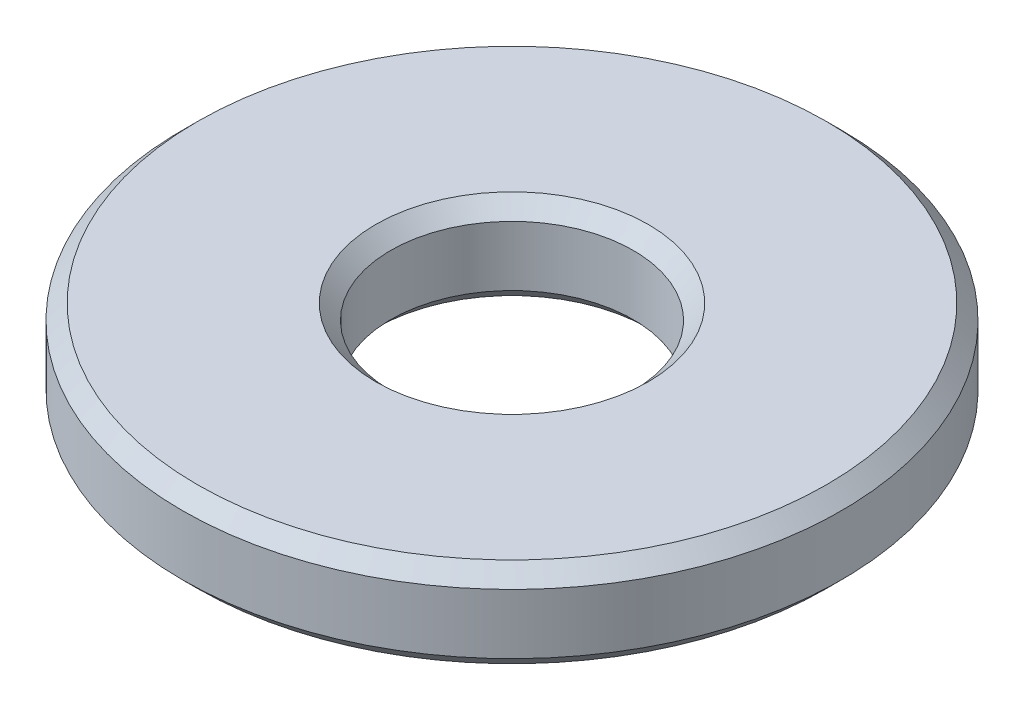
ISO-10303-21;
HEADER;
FILE_DESCRIPTION(('STEP AP214'),'2;1');
FILE_NAME('part.step','',(''),(''),'','','');
FILE_SCHEMA(('AUTOMOTIVE_DESIGN { 1 0 10303 214 1 1 1 1 }'));
ENDSEC;
DATA;
#1=APPLICATION_CONTEXT('core data for automotive mechanical design processes');
#2=APPLICATION_PROTOCOL_DEFINITION('international standard','automotive_design',2000,#1);
#3=PRODUCT_CONTEXT('',#1,'mechanical');
#4=PRODUCT('Part','Part','',(#3));
#5=PRODUCT_RELATED_PRODUCT_CATEGORY('part','',(#4));
#6=PRODUCT_DEFINITION_FORMATION('','',#4);
#7=PRODUCT_DEFINITION_CONTEXT('part definition',#1,'design');
#8=PRODUCT_DEFINITION('design','',#6,#7);
#9=PRODUCT_DEFINITION_SHAPE('','',#8);
#10=(LENGTH_UNIT() NAMED_UNIT(*) SI_UNIT(.MILLI.,.METRE.));
#11=(NAMED_UNIT(*) PLANE_ANGLE_UNIT() SI_UNIT($,.RADIAN.));
#12=(NAMED_UNIT(*) SI_UNIT($,.STERADIAN.) SOLID_ANGLE_UNIT());
#13=UNCERTAINTY_MEASURE_WITH_UNIT(LENGTH_MEASURE(1.E-05),#10,'distance_accuracy_value','');
#14=(GEOMETRIC_REPRESENTATION_CONTEXT(3) GLOBAL_UNCERTAINTY_ASSIGNED_CONTEXT((#13)) GLOBAL_UNIT_ASSIGNED_CONTEXT((#10,
#11,#12)) REPRESENTATION_CONTEXT('',''));
#15=CARTESIAN_POINT('',(0.,0.,0.));
#16=DIRECTION('',(0.,0.,1.));
#17=DIRECTION('',(1.,0.,0.));
#18=AXIS2_PLACEMENT_3D('',#15,#16,#17);
#19=CARTESIAN_POINT('',(0.,1.5,0.));
#20=DIRECTION('',(0.,1.,0.));
#21=DIRECTION('',(0.,0.,1.));
#22=AXIS2_PLACEMENT_3D('',#19,#20,#21);
#23=PLANE('',#22);
#24=CARTESIAN_POINT('',(0.,1.5,0.));
#25=DIRECTION('',(0.,1.,0.));
#26=DIRECTION('',(0.,0.,1.));
#27=AXIS2_PLACEMENT_3D('',#24,#25,#26);
#28=CIRCLE('',#27,10.5);
#29=CARTESIAN_POINT('',(0.,1.5,10.5));
#30=VERTEX_POINT('',#29);
#31=EDGE_CURVE('E53',#30,#30,#28,.T.);
#32=ORIENTED_EDGE('',*,*,#31,.T.);
#33=EDGE_LOOP('',(#32));
#34=FACE_BOUND('',#33,.T.);
#35=CARTESIAN_POINT('',(0.,1.5,0.));
#36=DIRECTION('',(0.,1.,0.));
#37=DIRECTION('',(0.,0.,1.));
#38=AXIS2_PLACEMENT_3D('',#35,#36,#37);
#39=CIRCLE('',#38,4.55000000000001);
#40=CARTESIAN_POINT('',(0.,1.5,4.55000000000001));
#41=VERTEX_POINT('',#40);
#42=EDGE_CURVE('E58',#41,#41,#39,.F.);
#43=ORIENTED_EDGE('',*,*,#42,.T.);
#44=EDGE_LOOP('',(#43));
#45=FACE_BOUND('',#44,.T.);
#46=ADVANCED_FACE('F39',(#34,#45),#23,.T.);
#47=CARTESIAN_POINT('',(0.,-1.5,0.));
#48=DIRECTION('',(0.,1.,0.));
#49=DIRECTION('',(0.,0.,1.));
#50=AXIS2_PLACEMENT_3D('',#47,#48,#49);
#51=PLANE('',#50);
#52=CARTESIAN_POINT('',(0.,-1.5,0.));
#53=DIRECTION('',(0.,1.,0.));
#54=DIRECTION('',(0.,0.,1.));
#55=AXIS2_PLACEMENT_3D('',#52,#53,#54);
#56=CIRCLE('',#55,10.5);
#57=CARTESIAN_POINT('',(0.,-1.5,10.5));
#58=VERTEX_POINT('',#57);
#59=EDGE_CURVE('E64',#58,#58,#56,.F.);
#60=ORIENTED_EDGE('',*,*,#59,.T.);
#61=EDGE_LOOP('',(#60));
#62=FACE_BOUND('',#61,.T.);
#63=CARTESIAN_POINT('',(0.,-1.5,0.));
#64=DIRECTION('',(0.,1.,0.));
#65=DIRECTION('',(0.,0.,1.));
#66=AXIS2_PLACEMENT_3D('',#63,#64,#65);
#67=CIRCLE('',#66,4.55);
#68=CARTESIAN_POINT('',(0.,-1.5,4.55));
#69=VERTEX_POINT('',#68);
#70=EDGE_CURVE('E68',#69,#69,#67,.T.);
#71=ORIENTED_EDGE('',*,*,#70,.T.);
#72=EDGE_LOOP('',(#71));
#73=FACE_BOUND('',#72,.T.);
#74=ADVANCED_FACE('F93',(#62,#73),#51,.F.);
#75=CARTESIAN_POINT('',(0.,1.5,0.));
#76=DIRECTION('',(0.,-1.,0.));
#77=DIRECTION('',(0.,0.,-1.));
#78=AXIS2_PLACEMENT_3D('',#75,#76,#77);
#79=CYLINDRICAL_SURFACE('',#78,11.);
#80=CARTESIAN_POINT('',(0.,-0.999999999999998,0.));
#81=DIRECTION('',(0.,1.,0.));
#82=DIRECTION('',(0.,0.,1.));
#83=AXIS2_PLACEMENT_3D('',#80,#81,#82);
#84=CIRCLE('',#83,11.);
#85=CARTESIAN_POINT('',(0.,-0.999999999999998,11.));
#86=VERTEX_POINT('',#85);
#87=EDGE_CURVE('E72',#86,#86,#84,.T.);
#88=ORIENTED_EDGE('',*,*,#87,.T.);
#89=EDGE_LOOP('',(#88));
#90=FACE_BOUND('',#89,.T.);
#91=CARTESIAN_POINT('',(0.,0.999999999999996,0.));
#92=DIRECTION('',(0.,1.,0.));
#93=DIRECTION('',(0.,0.,1.));
#94=AXIS2_PLACEMENT_3D('',#91,#92,#93);
#95=CIRCLE('',#94,11.);
#96=CARTESIAN_POINT('',(0.,0.999999999999996,11.));
#97=VERTEX_POINT('',#96);
#98=EDGE_CURVE('E76',#97,#97,#95,.F.);
#99=ORIENTED_EDGE('',*,*,#98,.T.);
#100=EDGE_LOOP('',(#99));
#101=FACE_BOUND('',#100,.T.);
#102=ADVANCED_FACE('F81',(#90,#101),#79,.T.);
#103=CARTESIAN_POINT('',(0.,1.5,0.));
#104=DIRECTION('',(0.,-1.,0.));
#105=DIRECTION('',(0.,0.,-1.));
#106=AXIS2_PLACEMENT_3D('',#103,#104,#105);
#107=CYLINDRICAL_SURFACE('',#106,4.05);
#108=CARTESIAN_POINT('',(0.,-0.999999999999998,0.));
#109=DIRECTION('',(0.,1.,0.));
#110=DIRECTION('',(0.,0.,1.));
#111=AXIS2_PLACEMENT_3D('',#108,#109,#110);
#112=CIRCLE('',#111,4.05);
#113=CARTESIAN_POINT('',(0.,-0.999999999999998,4.05));
#114=VERTEX_POINT('',#113);
#115=EDGE_CURVE('E10',#114,#114,#112,.F.);
#116=ORIENTED_EDGE('',*,*,#115,.T.);
#117=EDGE_LOOP('',(#116));
#118=FACE_BOUND('',#117,.T.);
#119=CARTESIAN_POINT('',(0.,0.999999999999998,0.));
#120=DIRECTION('',(0.,1.,0.));
#121=DIRECTION('',(0.,0.,1.));
#122=AXIS2_PLACEMENT_3D('',#119,#120,#121);
#123=CIRCLE('',#122,4.05);
#124=CARTESIAN_POINT('',(0.,0.999999999999998,4.05));
#125=VERTEX_POINT('',#124);
#126=EDGE_CURVE('E48',#125,#125,#123,.T.);
#127=ORIENTED_EDGE('',*,*,#126,.T.);
#128=EDGE_LOOP('',(#127));
#129=FACE_BOUND('',#128,.T.);
#130=ADVANCED_FACE('F118',(#118,#129),#107,.F.);
#131=CARTESIAN_POINT('',(0.,-0.999999999999998,0.));
#132=DIRECTION('',(0.,1.,0.));
#133=DIRECTION('',(0.,0.,1.));
#134=AXIS2_PLACEMENT_3D('',#131,#132,#133);
#135=CONICAL_SURFACE('',#134,11.,0.78539816339745);
#136=ORIENTED_EDGE('',*,*,#59,.F.);
#137=EDGE_LOOP('',(#136));
#138=FACE_BOUND('',#137,.T.);
#139=ORIENTED_EDGE('',*,*,#87,.F.);
#140=EDGE_LOOP('',(#139));
#141=FACE_BOUND('',#140,.T.);
#142=ADVANCED_FACE('F87',(#138,#141),#135,.T.);
#143=CARTESIAN_POINT('',(0.,1.5,0.));
#144=DIRECTION('',(0.,-1.,0.));
#145=DIRECTION('',(0.,0.,-1.));
#146=AXIS2_PLACEMENT_3D('',#143,#144,#145);
#147=CONICAL_SURFACE('',#146,10.5,0.785398163397441);
#148=ORIENTED_EDGE('',*,*,#98,.F.);
#149=EDGE_LOOP('',(#148));
#150=FACE_BOUND('',#149,.T.);
#151=ORIENTED_EDGE('',*,*,#31,.F.);
#152=EDGE_LOOP('',(#151));
#153=FACE_BOUND('',#152,.T.);
#154=ADVANCED_FACE('F83',(#150,#153),#147,.T.);
#155=CARTESIAN_POINT('',(0.,-1.5,0.));
#156=DIRECTION('',(0.,-1.,0.));
#157=DIRECTION('',(0.,0.,-1.));
#158=AXIS2_PLACEMENT_3D('',#155,#156,#157);
#159=CONICAL_SURFACE('',#158,4.55,0.785398163397441);
#160=ORIENTED_EDGE('',*,*,#115,.F.);
#161=EDGE_LOOP('',(#160));
#162=FACE_BOUND('',#161,.T.);
#163=ORIENTED_EDGE('',*,*,#70,.F.);
#164=EDGE_LOOP('',(#163));
#165=FACE_BOUND('',#164,.T.);
#166=ADVANCED_FACE('F86',(#162,#165),#159,.F.);
#167=CARTESIAN_POINT('',(0.,0.999999999999998,0.));
#168=DIRECTION('',(0.,1.,0.));
#169=DIRECTION('',(0.,0.,1.));
#170=AXIS2_PLACEMENT_3D('',#167,#168,#169);
#171=CONICAL_SURFACE('',#170,4.05,0.785398163397452);
#172=ORIENTED_EDGE('',*,*,#42,.F.);
#173=EDGE_LOOP('',(#172));
#174=FACE_BOUND('',#173,.T.);
#175=ORIENTED_EDGE('',*,*,#126,.F.);
#176=EDGE_LOOP('',(#175));
#177=FACE_BOUND('',#176,.T.);
#178=ADVANCED_FACE('F42',(#174,#177),#171,.F.);
#179=CLOSED_SHELL('',(#46,#74,#102,#130,#142,#154,#166,#178));
#180=MANIFOLD_SOLID_BREP('B2',#179);
#181=ADVANCED_BREP_SHAPE_REPRESENTATION('',(#18,#180),#14);
#182=SHAPE_DEFINITION_REPRESENTATION(#9,#181);
ENDSEC;
END-ISO-10303-21;
